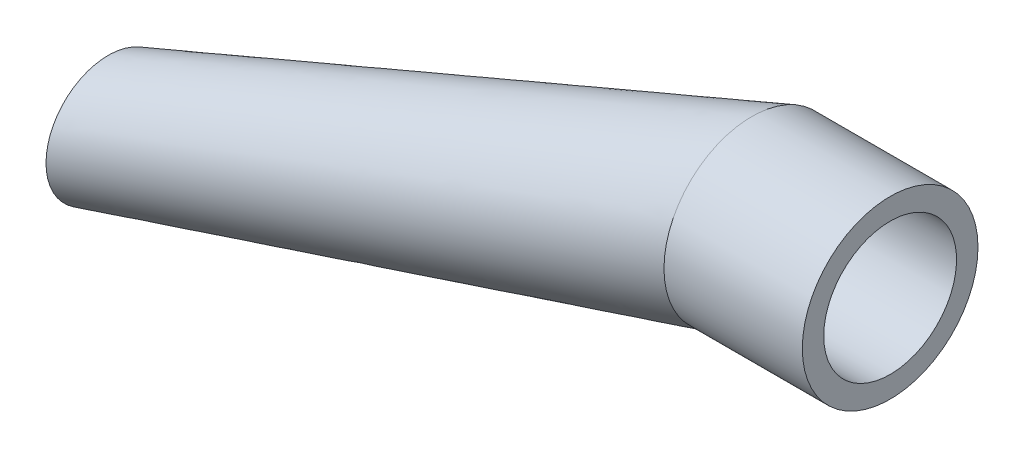
ISO-10303-21;
HEADER;
FILE_DESCRIPTION(('STEP AP214'),'2;1');
FILE_NAME('part.step','',(''),(''),'','','');
FILE_SCHEMA(('AUTOMOTIVE_DESIGN { 1 0 10303 214 1 1 1 1 }'));
ENDSEC;
DATA;
#1=APPLICATION_CONTEXT('core data for automotive mechanical design processes');
#2=APPLICATION_PROTOCOL_DEFINITION('international standard','automotive_design',2000,#1);
#3=PRODUCT_CONTEXT('',#1,'mechanical');
#4=PRODUCT('Part','Part','',(#3));
#5=PRODUCT_RELATED_PRODUCT_CATEGORY('part','',(#4));
#6=PRODUCT_DEFINITION_FORMATION('','',#4);
#7=PRODUCT_DEFINITION_CONTEXT('part definition',#1,'design');
#8=PRODUCT_DEFINITION('design','',#6,#7);
#9=PRODUCT_DEFINITION_SHAPE('','',#8);
#10=(LENGTH_UNIT() NAMED_UNIT(*) SI_UNIT(.MILLI.,.METRE.));
#11=(NAMED_UNIT(*) PLANE_ANGLE_UNIT() SI_UNIT($,.RADIAN.));
#12=(NAMED_UNIT(*) SI_UNIT($,.STERADIAN.) SOLID_ANGLE_UNIT());
#13=UNCERTAINTY_MEASURE_WITH_UNIT(LENGTH_MEASURE(1.E-05),#10,'distance_accuracy_value','');
#14=(GEOMETRIC_REPRESENTATION_CONTEXT(3) GLOBAL_UNCERTAINTY_ASSIGNED_CONTEXT((#13)) GLOBAL_UNIT_ASSIGNED_CONTEXT((#10,
#11,#12)) REPRESENTATION_CONTEXT('',''));
#15=CARTESIAN_POINT('',(0.,0.,0.));
#16=DIRECTION('',(0.,0.,1.));
#17=DIRECTION('',(1.,0.,0.));
#18=AXIS2_PLACEMENT_3D('',#15,#16,#17);
#19=CARTESIAN_POINT('',(66.,14.677159484003,-4.983070286594));
#20=DIRECTION('',(1.,0.,0.));
#21=DIRECTION('',(0.,0.,1.));
#22=AXIS2_PLACEMENT_3D('',#19,#20,#21);
#23=CYLINDRICAL_SURFACE('',#22,2.4);
#24=CARTESIAN_POINT('',(66.,14.677159484003,-2.583070286594));
#25=CARTESIAN_POINT('',(71.,14.677159484003,-2.583070286594));
#26=(BOUNDED_CURVE() B_SPLINE_CURVE(1,(#24,#25),.UNSPECIFIED.,.F.,
.F.) B_SPLINE_CURVE_WITH_KNOTS((2,2),(0.,1.),
.UNSPECIFIED.) CURVE() GEOMETRIC_REPRESENTATION_ITEM() RATIONAL_B_SPLINE_CURVE((1.,1.)) REPRESENTATION_ITEM(''));
#27=CARTESIAN_POINT('',(66.,14.677159484003,-2.583070286594));
#28=VERTEX_POINT('',#27);
#29=CARTESIAN_POINT('',(71.,14.677159484003,-2.583070286594));
#30=VERTEX_POINT('',#29);
#31=EDGE_CURVE('E11',#28,#30,#26,.T.);
#32=ORIENTED_EDGE('',*,*,#31,.T.);
#33=CARTESIAN_POINT('',(71.,14.677159484003,-4.983070286594));
#34=DIRECTION('',(1.,0.,0.));
#35=DIRECTION('',(0.,0.,1.));
#36=AXIS2_PLACEMENT_3D('',#33,#34,#35);
#37=CIRCLE('',#36,2.4);
#38=EDGE_CURVE('E29',#30,#30,#37,.T.);
#39=ORIENTED_EDGE('',*,*,#38,.T.);
#40=ORIENTED_EDGE('',*,*,#31,.F.);
#41=CARTESIAN_POINT('',(66.,14.677159484003,-4.983070286594));
#42=DIRECTION('',(1.,0.,0.));
#43=DIRECTION('',(0.,0.,1.));
#44=AXIS2_PLACEMENT_3D('',#41,#42,#43);
#45=CIRCLE('',#44,2.4);
#46=EDGE_CURVE('E81',#28,#28,#45,.T.);
#47=ORIENTED_EDGE('',*,*,#46,.F.);
#48=EDGE_LOOP('',(#32,#39,#40,#47));
#49=FACE_BOUND('',#48,.T.);
#50=ADVANCED_FACE('F17',(#49),#23,.F.);
#51=CARTESIAN_POINT('',(71.,14.677159484003,-4.983070286594));
#52=DIRECTION('',(1.,0.,0.));
#53=DIRECTION('',(0.,1.,0.));
#54=AXIS2_PLACEMENT_3D('',#51,#52,#53);
#55=PLANE('',#54);
#56=ORIENTED_EDGE('',*,*,#38,.F.);
#57=EDGE_LOOP('',(#56));
#58=FACE_BOUND('',#57,.T.);
#59=CARTESIAN_POINT('',(71.,14.677159484003,-4.983070286594));
#60=DIRECTION('',(1.,0.,0.));
#61=DIRECTION('',(0.,0.,1.));
#62=AXIS2_PLACEMENT_3D('',#59,#60,#61);
#63=CIRCLE('',#62,3.175);
#64=CARTESIAN_POINT('',(71.,14.677159484003,-1.808070286594));
#65=VERTEX_POINT('',#64);
#66=EDGE_CURVE('E82',#65,#65,#63,.T.);
#67=ORIENTED_EDGE('',*,*,#66,.T.);
#68=EDGE_LOOP('',(#67));
#69=FACE_BOUND('',#68,.T.);
#70=ADVANCED_FACE('F113',(#58,#69),#55,.T.);
#71=CARTESIAN_POINT('',(49.7,12.848733704041,3.627382664695));
#72=CARTESIAN_POINT('',(66.,14.677159484003,-2.583070286594));
#73=CARTESIAN_POINT('',(49.699999999994,12.051252491976,3.627382664695));
#74=CARTESIAN_POINT('',(65.999999999991,13.517186811906,-2.583070286594));
#75=CARTESIAN_POINT('',(49.700000000024,11.25377096101,3.209820187222));
#76=CARTESIAN_POINT('',(66.000000000039,12.357213675965,-3.190433890196));
#77=CARTESIAN_POINT('',(49.699999999937,10.694802915252,2.374720091732));
#78=CARTESIAN_POINT('',(65.999999999895,11.544169245745,-4.405124938168));
#79=CARTESIAN_POINT('',(49.70000000012,10.612832573184,1.271807717726));
#80=CARTESIAN_POINT('',(66.000000000207,11.424939657342,-6.009361118567));
#81=CARTESIAN_POINT('',(49.699999999832,11.141860389064,0.201287614448));
#82=CARTESIAN_POINT('',(65.999999999691,12.194434662155,-7.566481268748));
#83=CARTESIAN_POINT('',(49.700000000177,12.206145044529,-0.470722301671));
#84=CARTESIAN_POINT('',(66.000000000358,13.742485070248,-8.5439502377));
#85=CARTESIAN_POINT('',(49.699999999857,13.49132236356,-0.470722301677));
#86=CARTESIAN_POINT('',(65.99999999967,15.611833897766,-8.54395023766));
#87=CARTESIAN_POINT('',(49.700000000087,14.555607019002,0.201287614452));
#88=CARTESIAN_POINT('',(66.000000000244,17.159884305833,-7.56648126878));
#89=CARTESIAN_POINT('',(49.69999999996,15.084634834914,1.271807717724));
#90=CARTESIAN_POINT('',(65.999999999855,17.929379310682,-6.009361118547));
#91=CARTESIAN_POINT('',(49.700000000014,15.00266449282,2.374720091734));
#92=CARTESIAN_POINT('',(66.000000000067,17.810149722251,-4.405124938177));
#93=CARTESIAN_POINT('',(49.699999999997,14.443696447076,3.209820187221));
#94=CARTESIAN_POINT('',(65.999999999977,16.997105292046,-3.190433890192));
#95=CARTESIAN_POINT('',(49.7,13.646214916105,3.627382664695));
#96=CARTESIAN_POINT('',(66.000000000005,15.837132156098,-2.583070286594));
#97=CARTESIAN_POINT('',(49.7,12.848733704041,3.627382664695));
#98=CARTESIAN_POINT('',(66.,14.677159484003,-2.583070286594));
#99=(BOUNDED_SURFACE() B_SPLINE_SURFACE(13,1,((#71,#72),(#73,#74),(#75,#76),(#77,#78),(#79,#80),
(#81,#82),(#83,#84),(#85,#86),(#87,#88),(#89,#90),(#91,#92),(#93,#94),(#95,#96),(#97,#98)),
.UNSPECIFIED.,.T.,.F.,.F.) B_SPLINE_SURFACE_WITH_KNOTS((14,14),(2,2),(0.,6.28318530718),(0.,1.),
.UNSPECIFIED.) GEOMETRIC_REPRESENTATION_ITEM() RATIONAL_B_SPLINE_SURFACE(((1.,1.),(1.,1.),(1.,
1.),(1.,1.),(1.,1.),(1.,1.),(1.,1.),(1.,1.),(1.,1.),(1.,1.),(1.,1.),(1.,1.),(1.,1.),(1.,1.))) REPRESENTATION_ITEM('') SURFACE());
#100=CARTESIAN_POINT('',(49.7,12.848733704041,3.627382664695));
#101=CARTESIAN_POINT('',(66.,14.677159484003,-2.583070286594));
#102=(BOUNDED_CURVE() B_SPLINE_CURVE(1,(#100,#101),.UNSPECIFIED.,.F.,
.F.) B_SPLINE_CURVE_WITH_KNOTS((2,2),(0.,1.),
.UNSPECIFIED.) CURVE() GEOMETRIC_REPRESENTATION_ITEM() RATIONAL_B_SPLINE_CURVE((1.,1.)) REPRESENTATION_ITEM(''));
#103=CARTESIAN_POINT('',(49.7,12.848733704041,3.627382664695));
#104=VERTEX_POINT('',#103);
#105=EDGE_CURVE('E77',#104,#28,#102,.T.);
#106=CARTESIAN_POINT('',(49.7,12.848733704041,1.977382664695));
#107=DIRECTION('',(1.,0.,0.));
#108=DIRECTION('',(0.,0.,1.));
#109=AXIS2_PLACEMENT_3D('',#106,#107,#108);
#110=CIRCLE('',#109,1.65);
#111=EDGE_CURVE('E68',#104,#104,#110,.T.);
#112=ORIENTED_EDGE('',*,*,#105,.T.);
#113=ORIENTED_EDGE('',*,*,#46,.T.);
#114=ORIENTED_EDGE('',*,*,#105,.F.);
#115=ORIENTED_EDGE('',*,*,#111,.F.);
#116=EDGE_LOOP('',(#112,#113,#114,#115));
#117=FACE_BOUND('',#116,.T.);
#118=ADVANCED_FACE('F116',(#117),#99,.F.);
#119=CARTESIAN_POINT('',(66.,14.677159484003,-4.983070286594));
#120=DIRECTION('',(1.,0.,0.));
#121=DIRECTION('',(0.,0.,1.));
#122=AXIS2_PLACEMENT_3D('',#119,#120,#121);
#123=CYLINDRICAL_SURFACE('',#122,3.175);
#124=CARTESIAN_POINT('',(66.,14.677159484003,-4.983070286594));
#125=DIRECTION('',(1.,0.,0.));
#126=DIRECTION('',(0.,0.,1.));
#127=AXIS2_PLACEMENT_3D('',#124,#125,#126);
#128=CIRCLE('',#127,3.175);
#129=CARTESIAN_POINT('',(66.,14.677159484003,-1.808070286594));
#130=VERTEX_POINT('',#129);
#131=EDGE_CURVE('E62',#130,#130,#128,.T.);
#132=ORIENTED_EDGE('',*,*,#131,.T.);
#133=CARTESIAN_POINT('',(66.,14.677159484003,-1.808070286594));
#134=CARTESIAN_POINT('',(71.,14.677159484003,-1.808070286594));
#135=(BOUNDED_CURVE() B_SPLINE_CURVE(1,(#133,#134),.UNSPECIFIED.,.F.,
.F.) B_SPLINE_CURVE_WITH_KNOTS((2,2),(0.,1.),
.UNSPECIFIED.) CURVE() GEOMETRIC_REPRESENTATION_ITEM() RATIONAL_B_SPLINE_CURVE((1.,1.)) REPRESENTATION_ITEM(''));
#136=EDGE_CURVE('E95',#130,#65,#135,.T.);
#137=ORIENTED_EDGE('',*,*,#136,.T.);
#138=ORIENTED_EDGE('',*,*,#66,.F.);
#139=ORIENTED_EDGE('',*,*,#136,.F.);
#140=EDGE_LOOP('',(#132,#137,#138,#139));
#141=FACE_BOUND('',#140,.T.);
#142=ADVANCED_FACE('F120',(#141),#123,.T.);
#143=CARTESIAN_POINT('',(49.7,12.848733704041,1.977382664695));
#144=DIRECTION('',(1.,0.,0.));
#145=DIRECTION('',(0.,1.,0.));
#146=AXIS2_PLACEMENT_3D('',#143,#144,#145);
#147=PLANE('',#146);
#148=ORIENTED_EDGE('',*,*,#111,.T.);
#149=EDGE_LOOP('',(#148));
#150=FACE_BOUND('',#149,.T.);
#151=CARTESIAN_POINT('',(49.7,12.848733704041,1.977382664695));
#152=DIRECTION('',(1.,0.,0.));
#153=DIRECTION('',(0.,0.,1.));
#154=AXIS2_PLACEMENT_3D('',#151,#152,#153);
#155=CIRCLE('',#154,2.25);
#156=CARTESIAN_POINT('',(49.7,12.848733704041,4.227382664695));
#157=VERTEX_POINT('',#156);
#158=EDGE_CURVE('E60',#157,#157,#155,.T.);
#159=ORIENTED_EDGE('',*,*,#158,.F.);
#160=EDGE_LOOP('',(#159));
#161=FACE_BOUND('',#160,.T.);
#162=ADVANCED_FACE('F122',(#150,#161),#147,.F.);
#163=CARTESIAN_POINT('',(49.7,12.848733704041,4.227382664695));
#164=CARTESIAN_POINT('',(66.,14.677159484003,-1.808070286594));
#165=CARTESIAN_POINT('',(49.699999999994,11.761259323953,4.227382664695));
#166=CARTESIAN_POINT('',(65.999999999991,13.142612303208,-1.808070286594));
#167=CARTESIAN_POINT('',(49.700000000024,10.673784508997,3.657979286322));
#168=CARTESIAN_POINT('',(66.000000000039,11.608064508787,-2.611561720522));
#169=CARTESIAN_POINT('',(49.699999999937,9.911555355698,2.519206428839));
#170=CARTESIAN_POINT('',(65.999999999895,10.532474481304,-4.218496752748));
#171=CARTESIAN_POINT('',(49.70000000012,9.799777616499,1.015235009733));
#172=CARTESIAN_POINT('',(66.000000000207,10.374743671656,-6.340767533039));
#173=CARTESIAN_POINT('',(49.699999999832,10.521179183633,-0.44456513109));
#174=CARTESIAN_POINT('',(65.999999999691,11.392721438423,-8.400707731764));
#175=CARTESIAN_POINT('',(49.700000000177,11.972476441053,-1.360942289449));
#176=CARTESIAN_POINT('',(66.000000000358,13.440663124155,-9.693817721875));
#177=CARTESIAN_POINT('',(49.699999999857,13.724990967037,-1.360942289441));
#178=CARTESIAN_POINT('',(65.99999999967,15.913655843859,-9.693817721894));
#179=CARTESIAN_POINT('',(49.700000000087,15.17628822443,-0.444565131096));
#180=CARTESIAN_POINT('',(66.000000000244,17.961597529566,-8.400707731748));
#181=CARTESIAN_POINT('',(49.69999999996,15.897689791603,1.015235009738));
#182=CARTESIAN_POINT('',(65.999999999855,18.979575296367,-6.34076753305));
#183=CARTESIAN_POINT('',(49.700000000014,15.785912052372,2.519206428837));
#184=CARTESIAN_POINT('',(66.000000000067,18.821844486692,-4.218496752742));
#185=CARTESIAN_POINT('',(49.699999999997,15.023682899091,3.657979286322));
#186=CARTESIAN_POINT('',(65.999999999977,17.746254459223,-2.611561720524));
#187=CARTESIAN_POINT('',(49.7,13.936208084128,4.227382664695));
#188=CARTESIAN_POINT('',(66.000000000005,16.211706664797,-1.808070286594));
#189=CARTESIAN_POINT('',(49.7,12.848733704041,4.227382664695));
#190=CARTESIAN_POINT('',(66.,14.677159484003,-1.808070286594));
#191=(BOUNDED_SURFACE() B_SPLINE_SURFACE(13,1,((#163,#164),(#165,#166),(#167,#168),(#169,#170),
(#171,#172),(#173,#174),(#175,#176),(#177,#178),(#179,#180),(#181,#182),(#183,#184),(#185,#186),
(#187,#188),(#189,#190)),.UNSPECIFIED.,.T.,.F.,.F.) B_SPLINE_SURFACE_WITH_KNOTS((14,14),(2,2),
(0.,6.28318530718),(0.,1.),
.UNSPECIFIED.) GEOMETRIC_REPRESENTATION_ITEM() RATIONAL_B_SPLINE_SURFACE(((1.,1.),(1.,1.),(1.,
1.),(1.,1.),(1.,1.),(1.,1.),(1.,1.),(1.,1.),(1.,1.),(1.,1.),(1.,1.),(1.,1.),(1.,1.),(1.,1.))) REPRESENTATION_ITEM('') SURFACE());
#192=CARTESIAN_POINT('',(49.7,12.848733704041,4.227382664695));
#193=CARTESIAN_POINT('',(66.,14.677159484003,-1.808070286594));
#194=(BOUNDED_CURVE() B_SPLINE_CURVE(1,(#192,#193),.UNSPECIFIED.,.F.,
.F.) B_SPLINE_CURVE_WITH_KNOTS((2,2),(0.,1.),
.UNSPECIFIED.) CURVE() GEOMETRIC_REPRESENTATION_ITEM() RATIONAL_B_SPLINE_CURVE((1.,1.)) REPRESENTATION_ITEM(''));
#195=EDGE_CURVE('E20',#157,#130,#194,.T.);
#196=ORIENTED_EDGE('',*,*,#158,.T.);
#197=ORIENTED_EDGE('',*,*,#195,.T.);
#198=ORIENTED_EDGE('',*,*,#131,.F.);
#199=ORIENTED_EDGE('',*,*,#195,.F.);
#200=EDGE_LOOP('',(#196,#197,#198,#199));
#201=FACE_BOUND('',#200,.T.);
#202=ADVANCED_FACE('F58',(#201),#191,.T.);
#203=CLOSED_SHELL('',(#50,#70,#118,#142,#162,#202));
#204=MANIFOLD_SOLID_BREP('B1',#203);
#205=ADVANCED_BREP_SHAPE_REPRESENTATION('',(#18,#204),#14);
#206=SHAPE_DEFINITION_REPRESENTATION(#9,#205);
ENDSEC;
END-ISO-10303-21;
